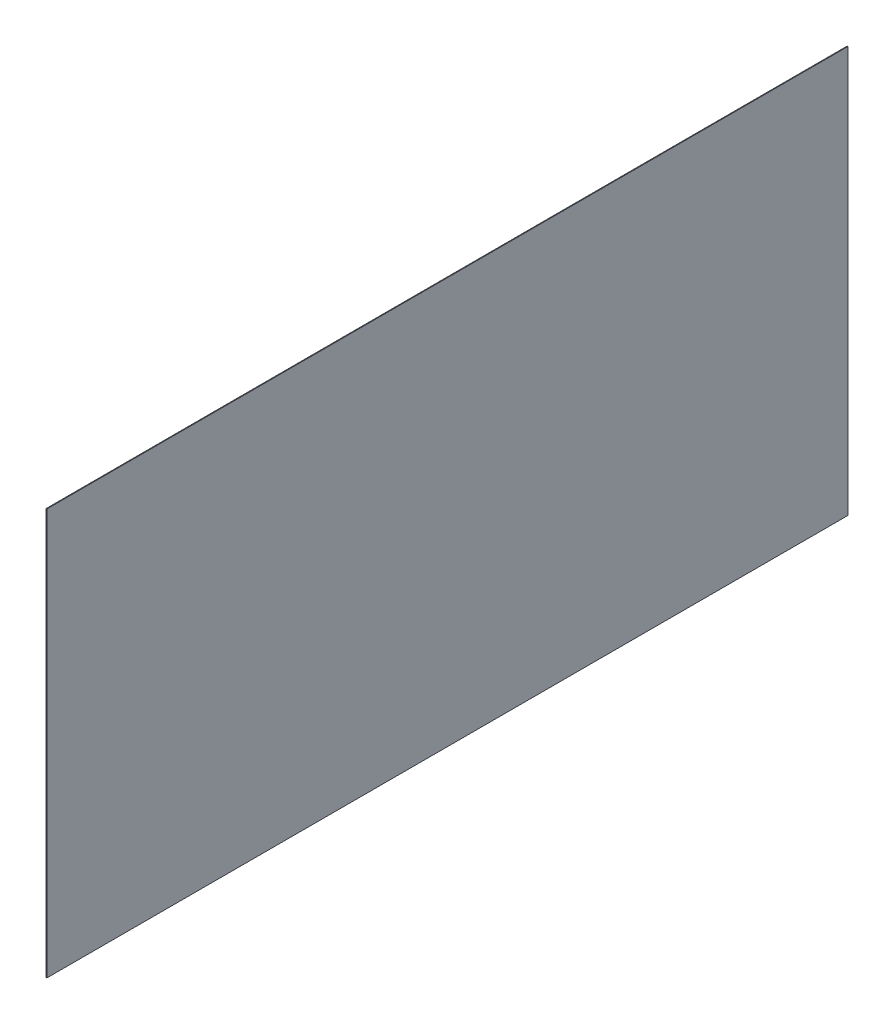
ISO-10303-21;
HEADER;
FILE_DESCRIPTION(('STEP AP214'),'2;1');
FILE_NAME('part.step','',(''),(''),'','','');
FILE_SCHEMA(('AUTOMOTIVE_DESIGN { 1 0 10303 214 1 1 1 1 }'));
ENDSEC;
DATA;
#1=APPLICATION_CONTEXT('core data for automotive mechanical design processes');
#2=APPLICATION_PROTOCOL_DEFINITION('international standard','automotive_design',2000,#1);
#3=PRODUCT_CONTEXT('',#1,'mechanical');
#4=PRODUCT('Part','Part','',(#3));
#5=PRODUCT_RELATED_PRODUCT_CATEGORY('part','',(#4));
#6=PRODUCT_DEFINITION_FORMATION('','',#4);
#7=PRODUCT_DEFINITION_CONTEXT('part definition',#1,'design');
#8=PRODUCT_DEFINITION('design','',#6,#7);
#9=PRODUCT_DEFINITION_SHAPE('','',#8);
#10=(LENGTH_UNIT() NAMED_UNIT(*) SI_UNIT(.MILLI.,.METRE.));
#11=(NAMED_UNIT(*) PLANE_ANGLE_UNIT() SI_UNIT($,.RADIAN.));
#12=(NAMED_UNIT(*) SI_UNIT($,.STERADIAN.) SOLID_ANGLE_UNIT());
#13=UNCERTAINTY_MEASURE_WITH_UNIT(LENGTH_MEASURE(1.E-05),#10,'distance_accuracy_value','');
#14=(GEOMETRIC_REPRESENTATION_CONTEXT(3) GLOBAL_UNCERTAINTY_ASSIGNED_CONTEXT((#13)) GLOBAL_UNIT_ASSIGNED_CONTEXT((#10,
#11,#12)) REPRESENTATION_CONTEXT('',''));
#15=CARTESIAN_POINT('',(0.,0.,0.));
#16=DIRECTION('',(0.,0.,1.));
#17=DIRECTION('',(1.,0.,0.));
#18=AXIS2_PLACEMENT_3D('',#15,#16,#17);
#19=CARTESIAN_POINT('',(-125.327,-60.,150.));
#20=DIRECTION('',(0.,-1.,0.));
#21=DIRECTION('',(0.,0.,-1.));
#22=AXIS2_PLACEMENT_3D('',#19,#20,#21);
#23=PLANE('',#22);
#24=DIRECTION('',(-1.,0.,0.));
#25=VECTOR('',#24,1.);
#26=CARTESIAN_POINT('',(-115.327,-60.,71.));
#27=LINE('',#26,#25);
#28=CARTESIAN_POINT('',(-125.2,-60.,71.));
#29=VERTEX_POINT('',#28);
#30=CARTESIAN_POINT('',(-125.327,-60.,71.));
#31=VERTEX_POINT('',#30);
#32=EDGE_CURVE('E65',#29,#31,#27,.T.);
#33=ORIENTED_EDGE('',*,*,#32,.T.);
#34=DIRECTION('',(0.,0.,-1.));
#35=VECTOR('',#34,1.);
#36=CARTESIAN_POINT('',(-125.327,-60.,150.));
#37=LINE('',#36,#35);
#38=CARTESIAN_POINT('',(-125.327,-60.,-70.9999999999999));
#39=VERTEX_POINT('',#38);
#40=EDGE_CURVE('E97',#31,#39,#37,.T.);
#41=ORIENTED_EDGE('',*,*,#40,.T.);
#42=DIRECTION('',(-1.,0.,0.));
#43=VECTOR('',#42,1.);
#44=CARTESIAN_POINT('',(-115.327,-60.,-70.9999999999999));
#45=LINE('',#44,#43);
#46=CARTESIAN_POINT('',(-125.2,-60.,-70.9999999999999));
#47=VERTEX_POINT('',#46);
#48=EDGE_CURVE('E80',#47,#39,#45,.T.);
#49=ORIENTED_EDGE('',*,*,#48,.F.);
#50=DIRECTION('',(0.,0.,-1.));
#51=VECTOR('',#50,1.);
#52=CARTESIAN_POINT('',(-125.2,-60.,150.));
#53=LINE('',#52,#51);
#54=EDGE_CURVE('E101',#29,#47,#53,.T.);
#55=ORIENTED_EDGE('',*,*,#54,.F.);
#56=EDGE_LOOP('',(#33,#41,#49,#55));
#57=FACE_BOUND('',#56,.T.);
#58=ADVANCED_FACE('F43',(#57),#23,.T.);
#59=CARTESIAN_POINT('',(-125.327,0.,0.));
#60=DIRECTION('',(-1.,0.,0.));
#61=DIRECTION('',(0.,0.,1.));
#62=AXIS2_PLACEMENT_3D('',#59,#60,#61);
#63=PLANE('',#62);
#64=DIRECTION('',(0.,-1.,0.));
#65=VECTOR('',#64,1.);
#66=CARTESIAN_POINT('',(-125.327,12.,71.));
#67=LINE('',#66,#65);
#68=CARTESIAN_POINT('',(-125.327,12.,71.));
#69=VERTEX_POINT('',#68);
#70=EDGE_CURVE('E91',#69,#31,#67,.T.);
#71=ORIENTED_EDGE('',*,*,#70,.F.);
#72=DIRECTION('',(0.,0.,1.));
#73=VECTOR('',#72,1.);
#74=CARTESIAN_POINT('',(-125.327,12.,-70.9999999999999));
#75=LINE('',#74,#73);
#76=CARTESIAN_POINT('',(-125.327,12.,-70.9999999999999));
#77=VERTEX_POINT('',#76);
#78=EDGE_CURVE('E99',#77,#69,#75,.T.);
#79=ORIENTED_EDGE('',*,*,#78,.F.);
#80=DIRECTION('',(0.,1.,0.));
#81=VECTOR('',#80,1.);
#82=CARTESIAN_POINT('',(-125.327,-60.,-70.9999999999999));
#83=LINE('',#82,#81);
#84=EDGE_CURVE('E83',#39,#77,#83,.T.);
#85=ORIENTED_EDGE('',*,*,#84,.F.);
#86=ORIENTED_EDGE('',*,*,#40,.F.);
#87=EDGE_LOOP('',(#71,#79,#85,#86));
#88=FACE_BOUND('',#87,.T.);
#89=ADVANCED_FACE('F96',(#88),#63,.T.);
#90=CARTESIAN_POINT('',(-125.2,0.,0.));
#91=DIRECTION('',(-1.,0.,0.));
#92=DIRECTION('',(0.,0.,1.));
#93=AXIS2_PLACEMENT_3D('',#90,#91,#92);
#94=PLANE('',#93);
#95=DIRECTION('',(0.,0.,1.));
#96=VECTOR('',#95,1.);
#97=CARTESIAN_POINT('',(-125.2,12.,0.));
#98=LINE('',#97,#96);
#99=CARTESIAN_POINT('',(-125.2,12.,-70.9999999999999));
#100=VERTEX_POINT('',#99);
#101=CARTESIAN_POINT('',(-125.2,12.,71.));
#102=VERTEX_POINT('',#101);
#103=EDGE_CURVE('E50',#100,#102,#98,.T.);
#104=ORIENTED_EDGE('',*,*,#103,.T.);
#105=DIRECTION('',(0.,-1.,0.));
#106=VECTOR('',#105,1.);
#107=CARTESIAN_POINT('',(-125.2,0.,71.));
#108=LINE('',#107,#106);
#109=EDGE_CURVE('E11',#102,#29,#108,.T.);
#110=ORIENTED_EDGE('',*,*,#109,.T.);
#111=ORIENTED_EDGE('',*,*,#54,.T.);
#112=DIRECTION('',(0.,1.,0.));
#113=VECTOR('',#112,1.);
#114=CARTESIAN_POINT('',(-125.2,0.,-70.9999999999999));
#115=LINE('',#114,#113);
#116=EDGE_CURVE('E86',#47,#100,#115,.T.);
#117=ORIENTED_EDGE('',*,*,#116,.T.);
#118=EDGE_LOOP('',(#104,#110,#111,#117));
#119=FACE_BOUND('',#118,.T.);
#120=ADVANCED_FACE('F108',(#119),#94,.F.);
#121=CARTESIAN_POINT('',(-115.327,12.,71.));
#122=DIRECTION('',(0.,0.,-1.));
#123=DIRECTION('',(-1.,0.,0.));
#124=AXIS2_PLACEMENT_3D('',#121,#122,#123);
#125=PLANE('',#124);
#126=DIRECTION('',(-1.,0.,0.));
#127=VECTOR('',#126,1.);
#128=CARTESIAN_POINT('',(-115.327,12.,71.));
#129=LINE('',#128,#127);
#130=EDGE_CURVE('E112',#102,#69,#129,.T.);
#131=ORIENTED_EDGE('',*,*,#130,.T.);
#132=ORIENTED_EDGE('',*,*,#70,.T.);
#133=ORIENTED_EDGE('',*,*,#32,.F.);
#134=ORIENTED_EDGE('',*,*,#109,.F.);
#135=EDGE_LOOP('',(#131,#132,#133,#134));
#136=FACE_BOUND('',#135,.T.);
#137=ADVANCED_FACE('F117',(#136),#125,.F.);
#138=CARTESIAN_POINT('',(-115.327,12.,-70.9999999999999));
#139=DIRECTION('',(0.,-1.,0.));
#140=DIRECTION('',(0.,0.,-1.));
#141=AXIS2_PLACEMENT_3D('',#138,#139,#140);
#142=PLANE('',#141);
#143=DIRECTION('',(-1.,0.,0.));
#144=VECTOR('',#143,1.);
#145=CARTESIAN_POINT('',(-115.327,12.,-70.9999999999999));
#146=LINE('',#145,#144);
#147=EDGE_CURVE('E57',#100,#77,#146,.T.);
#148=ORIENTED_EDGE('',*,*,#147,.T.);
#149=ORIENTED_EDGE('',*,*,#78,.T.);
#150=ORIENTED_EDGE('',*,*,#130,.F.);
#151=ORIENTED_EDGE('',*,*,#103,.F.);
#152=EDGE_LOOP('',(#148,#149,#150,#151));
#153=FACE_BOUND('',#152,.T.);
#154=ADVANCED_FACE('F111',(#153),#142,.F.);
#155=CARTESIAN_POINT('',(-115.327,-60.,-70.9999999999999));
#156=DIRECTION('',(0.,0.,1.));
#157=DIRECTION('',(1.,0.,0.));
#158=AXIS2_PLACEMENT_3D('',#155,#156,#157);
#159=PLANE('',#158);
#160=ORIENTED_EDGE('',*,*,#48,.T.);
#161=ORIENTED_EDGE('',*,*,#84,.T.);
#162=ORIENTED_EDGE('',*,*,#147,.F.);
#163=ORIENTED_EDGE('',*,*,#116,.F.);
#164=EDGE_LOOP('',(#160,#161,#162,#163));
#165=FACE_BOUND('',#164,.T.);
#166=ADVANCED_FACE('F82',(#165),#159,.F.);
#167=CLOSED_SHELL('',(#58,#89,#120,#137,#154,#166));
#168=MANIFOLD_SOLID_BREP('B2',#167);
#169=ADVANCED_BREP_SHAPE_REPRESENTATION('',(#18,#168),#14);
#170=SHAPE_DEFINITION_REPRESENTATION(#9,#169);
ENDSEC;
END-ISO-10303-21;
